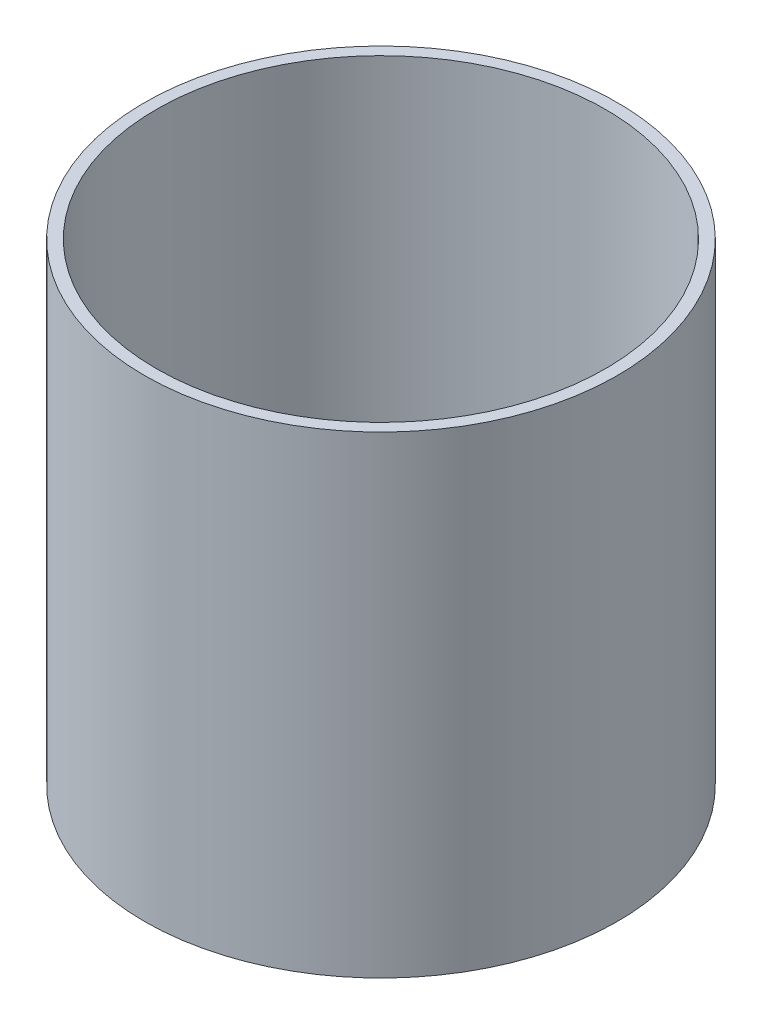
ISO-10303-21;
HEADER;
FILE_DESCRIPTION(('STEP AP214'),'2;1');
FILE_NAME('part.step','',(''),(''),'','','');
FILE_SCHEMA(('AUTOMOTIVE_DESIGN { 1 0 10303 214 1 1 1 1 }'));
ENDSEC;
DATA;
#1=APPLICATION_CONTEXT('core data for automotive mechanical design processes');
#2=APPLICATION_PROTOCOL_DEFINITION('international standard','automotive_design',2000,#1);
#3=PRODUCT_CONTEXT('',#1,'mechanical');
#4=PRODUCT('Part','Part','',(#3));
#5=PRODUCT_RELATED_PRODUCT_CATEGORY('part','',(#4));
#6=PRODUCT_DEFINITION_FORMATION('','',#4);
#7=PRODUCT_DEFINITION_CONTEXT('part definition',#1,'design');
#8=PRODUCT_DEFINITION('design','',#6,#7);
#9=PRODUCT_DEFINITION_SHAPE('','',#8);
#10=(LENGTH_UNIT() NAMED_UNIT(*) SI_UNIT(.MILLI.,.METRE.));
#11=(NAMED_UNIT(*) PLANE_ANGLE_UNIT() SI_UNIT($,.RADIAN.));
#12=(NAMED_UNIT(*) SI_UNIT($,.STERADIAN.) SOLID_ANGLE_UNIT());
#13=UNCERTAINTY_MEASURE_WITH_UNIT(LENGTH_MEASURE(1.E-05),#10,'distance_accuracy_value','');
#14=(GEOMETRIC_REPRESENTATION_CONTEXT(3) GLOBAL_UNCERTAINTY_ASSIGNED_CONTEXT((#13)) GLOBAL_UNIT_ASSIGNED_CONTEXT((#10,
#11,#12)) REPRESENTATION_CONTEXT('',''));
#15=CARTESIAN_POINT('',(0.,0.,0.));
#16=DIRECTION('',(0.,0.,1.));
#17=DIRECTION('',(1.,0.,0.));
#18=AXIS2_PLACEMENT_3D('',#15,#16,#17);
#19=CARTESIAN_POINT('',(-36.4028763902928,100.,-20.2238202168293));
#20=DIRECTION('',(0.,-1.,0.));
#21=DIRECTION('',(0.,0.,-1.));
#22=AXIS2_PLACEMENT_3D('',#19,#20,#21);
#23=CYLINDRICAL_SURFACE('',#22,50.);
#24=CARTESIAN_POINT('',(-36.4028763902928,100.,-20.2238202168293));
#25=DIRECTION('',(0.,1.,0.));
#26=DIRECTION('',(0.,0.,1.));
#27=AXIS2_PLACEMENT_3D('',#24,#25,#26);
#28=CIRCLE('',#27,50.);
#29=CARTESIAN_POINT('',(-36.4028763902928,100.,29.7761797831707));
#30=VERTEX_POINT('',#29);
#31=EDGE_CURVE('E10',#30,#30,#28,.T.);
#32=ORIENTED_EDGE('',*,*,#31,.F.);
#33=EDGE_LOOP('',(#32));
#34=FACE_BOUND('',#33,.T.);
#35=CARTESIAN_POINT('',(-36.4028763902928,0.,-20.2238202168293));
#36=DIRECTION('',(0.,1.,0.));
#37=DIRECTION('',(0.,0.,1.));
#38=AXIS2_PLACEMENT_3D('',#35,#36,#37);
#39=CIRCLE('',#38,50.);
#40=CARTESIAN_POINT('',(-36.4028763902928,0.,29.7761797831707));
#41=VERTEX_POINT('',#40);
#42=EDGE_CURVE('E34',#41,#41,#39,.T.);
#43=ORIENTED_EDGE('',*,*,#42,.T.);
#44=EDGE_LOOP('',(#43));
#45=FACE_BOUND('',#44,.T.);
#46=ADVANCED_FACE('F31',(#34,#45),#23,.T.);
#47=CARTESIAN_POINT('',(-36.4028763902928,100.,-20.2238202168293));
#48=DIRECTION('',(0.,1.,0.));
#49=DIRECTION('',(0.,0.,1.));
#50=AXIS2_PLACEMENT_3D('',#47,#48,#49);
#51=PLANE('',#50);
#52=CARTESIAN_POINT('',(-36.4028763902928,100.,-20.2238202168293));
#53=DIRECTION('',(0.,1.,0.));
#54=DIRECTION('',(0.,0.,1.));
#55=AXIS2_PLACEMENT_3D('',#52,#53,#54);
#56=CIRCLE('',#55,47.5);
#57=CARTESIAN_POINT('',(-36.4028763902928,100.,27.2761797831707));
#58=VERTEX_POINT('',#57);
#59=EDGE_CURVE('E43',#58,#58,#56,.T.);
#60=ORIENTED_EDGE('',*,*,#59,.F.);
#61=EDGE_LOOP('',(#60));
#62=FACE_BOUND('',#61,.T.);
#63=ORIENTED_EDGE('',*,*,#31,.T.);
#64=EDGE_LOOP('',(#63));
#65=FACE_BOUND('',#64,.T.);
#66=ADVANCED_FACE('F58',(#62,#65),#51,.T.);
#67=CARTESIAN_POINT('',(-36.4028763902928,0.,-20.2238202168293));
#68=DIRECTION('',(0.,1.,0.));
#69=DIRECTION('',(0.,0.,1.));
#70=AXIS2_PLACEMENT_3D('',#67,#68,#69);
#71=PLANE('',#70);
#72=ORIENTED_EDGE('',*,*,#42,.F.);
#73=EDGE_LOOP('',(#72));
#74=FACE_BOUND('',#73,.T.);
#75=ADVANCED_FACE('F54',(#74),#71,.F.);
#76=CARTESIAN_POINT('',(-36.4028763902928,5.,-20.2238202168293));
#77=DIRECTION('',(0.,1.,0.));
#78=DIRECTION('',(0.,0.,1.));
#79=AXIS2_PLACEMENT_3D('',#76,#77,#78);
#80=CYLINDRICAL_SURFACE('',#79,47.5);
#81=CARTESIAN_POINT('',(-36.4028763902928,5.,-20.2238202168293));
#82=DIRECTION('',(0.,1.,0.));
#83=DIRECTION('',(0.,0.,1.));
#84=AXIS2_PLACEMENT_3D('',#81,#82,#83);
#85=CIRCLE('',#84,47.5);
#86=CARTESIAN_POINT('',(-36.4028763902928,5.,27.2761797831707));
#87=VERTEX_POINT('',#86);
#88=EDGE_CURVE('E41',#87,#87,#85,.T.);
#89=ORIENTED_EDGE('',*,*,#88,.F.);
#90=EDGE_LOOP('',(#89));
#91=FACE_BOUND('',#90,.T.);
#92=ORIENTED_EDGE('',*,*,#59,.T.);
#93=EDGE_LOOP('',(#92));
#94=FACE_BOUND('',#93,.T.);
#95=ADVANCED_FACE('F51',(#91,#94),#80,.F.);
#96=CARTESIAN_POINT('',(-36.4028763902928,5.,-20.2238202168293));
#97=DIRECTION('',(0.,1.,0.));
#98=DIRECTION('',(0.,0.,1.));
#99=AXIS2_PLACEMENT_3D('',#96,#97,#98);
#100=PLANE('',#99);
#101=ORIENTED_EDGE('',*,*,#88,.T.);
#102=EDGE_LOOP('',(#101));
#103=FACE_BOUND('',#102,.T.);
#104=ADVANCED_FACE('F49',(#103),#100,.T.);
#105=CLOSED_SHELL('',(#46,#66,#75,#95,#104));
#106=MANIFOLD_SOLID_BREP('B2',#105);
#107=ADVANCED_BREP_SHAPE_REPRESENTATION('',(#18,#106),#14);
#108=SHAPE_DEFINITION_REPRESENTATION(#9,#107);
ENDSEC;
END-ISO-10303-21;
